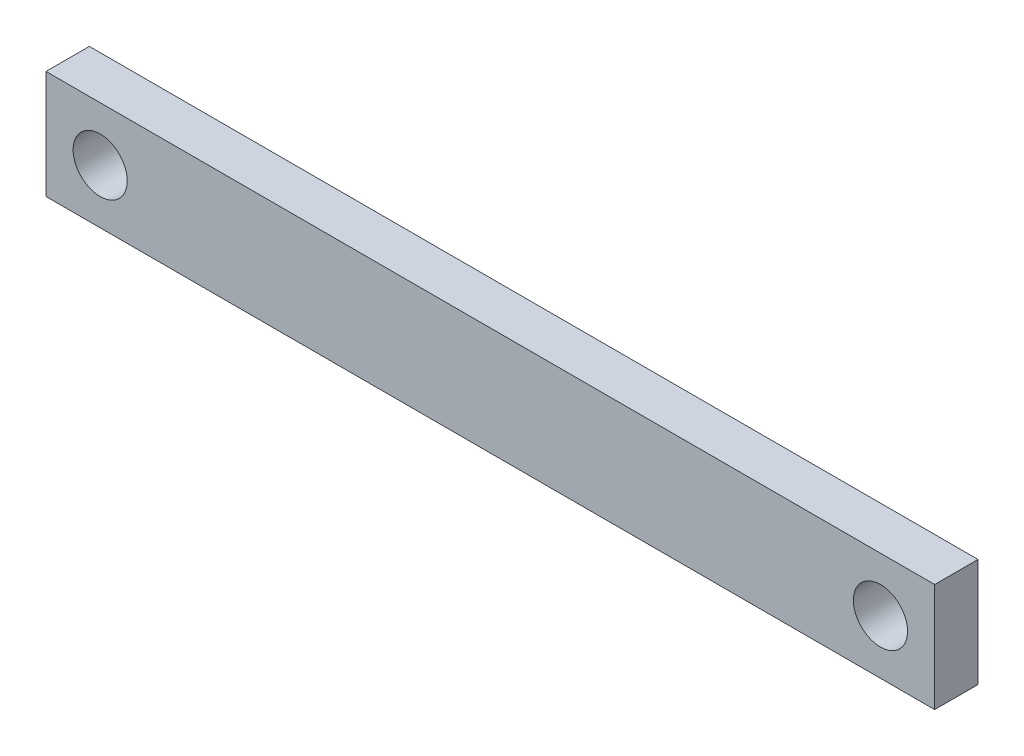
ISO-10303-21;
HEADER;
FILE_DESCRIPTION(('STEP AP214'),'2;1');
FILE_NAME('part.step','',(''),(''),'','','');
FILE_SCHEMA(('AUTOMOTIVE_DESIGN { 1 0 10303 214 1 1 1 1 }'));
ENDSEC;
DATA;
#1=APPLICATION_CONTEXT('core data for automotive mechanical design processes');
#2=APPLICATION_PROTOCOL_DEFINITION('international standard','automotive_design',2000,#1);
#3=PRODUCT_CONTEXT('',#1,'mechanical');
#4=PRODUCT('Part','Part','',(#3));
#5=PRODUCT_RELATED_PRODUCT_CATEGORY('part','',(#4));
#6=PRODUCT_DEFINITION_FORMATION('','',#4);
#7=PRODUCT_DEFINITION_CONTEXT('part definition',#1,'design');
#8=PRODUCT_DEFINITION('design','',#6,#7);
#9=PRODUCT_DEFINITION_SHAPE('','',#8);
#10=(LENGTH_UNIT() NAMED_UNIT(*) SI_UNIT(.MILLI.,.METRE.));
#11=(NAMED_UNIT(*) PLANE_ANGLE_UNIT() SI_UNIT($,.RADIAN.));
#12=(NAMED_UNIT(*) SI_UNIT($,.STERADIAN.) SOLID_ANGLE_UNIT());
#13=UNCERTAINTY_MEASURE_WITH_UNIT(LENGTH_MEASURE(1.E-05),#10,'distance_accuracy_value','');
#14=(GEOMETRIC_REPRESENTATION_CONTEXT(3) GLOBAL_UNCERTAINTY_ASSIGNED_CONTEXT((#13)) GLOBAL_UNIT_ASSIGNED_CONTEXT((#10,
#11,#12)) REPRESENTATION_CONTEXT('',''));
#15=CARTESIAN_POINT('',(0.,0.,0.));
#16=DIRECTION('',(0.,0.,1.));
#17=DIRECTION('',(1.,0.,0.));
#18=AXIS2_PLACEMENT_3D('',#15,#16,#17);
#19=CARTESIAN_POINT('',(0.,0.,2.));
#20=DIRECTION('',(0.,0.,1.));
#21=DIRECTION('',(1.,0.,0.));
#22=AXIS2_PLACEMENT_3D('',#19,#20,#21);
#23=PLANE('',#22);
#24=CARTESIAN_POINT('',(-14.7083649519347,9.32020141832394,2.));
#25=DIRECTION('',(0.,0.,1.));
#26=DIRECTION('',(1.,0.,0.));
#27=AXIS2_PLACEMENT_3D('',#24,#25,#26);
#28=CIRCLE('',#27,1.25);
#29=CARTESIAN_POINT('',(-13.4583649519347,9.32020141832394,2.));
#30=VERTEX_POINT('',#29);
#31=EDGE_CURVE('E100',#30,#30,#28,.T.);
#32=ORIENTED_EDGE('',*,*,#31,.F.);
#33=EDGE_LOOP('',(#32));
#34=FACE_BOUND('',#33,.T.);
#35=DIRECTION('',(0.,-1.,0.));
#36=VECTOR('',#35,1.);
#37=CARTESIAN_POINT('',(-17.2083649519347,11.8202014183239,2.));
#38=LINE('',#37,#36);
#39=CARTESIAN_POINT('',(-17.2083649519347,11.8202014183239,2.));
#40=VERTEX_POINT('',#39);
#41=CARTESIAN_POINT('',(-17.2083649519347,6.82020141832394,2.));
#42=VERTEX_POINT('',#41);
#43=EDGE_CURVE('E85',#40,#42,#38,.T.);
#44=ORIENTED_EDGE('',*,*,#43,.T.);
#45=DIRECTION('',(1.,0.,0.));
#46=VECTOR('',#45,1.);
#47=CARTESIAN_POINT('',(-17.2083649519347,6.82020141832394,2.));
#48=LINE('',#47,#46);
#49=CARTESIAN_POINT('',(23.7916350480653,6.82020141832394,2.));
#50=VERTEX_POINT('',#49);
#51=EDGE_CURVE('E80',#42,#50,#48,.T.);
#52=ORIENTED_EDGE('',*,*,#51,.T.);
#53=DIRECTION('',(0.,1.,0.));
#54=VECTOR('',#53,1.);
#55=CARTESIAN_POINT('',(23.7916350480653,11.8202014183239,2.));
#56=LINE('',#55,#54);
#57=CARTESIAN_POINT('',(23.7916350480653,11.8202014183239,2.));
#58=VERTEX_POINT('',#57);
#59=EDGE_CURVE('E83',#50,#58,#56,.T.);
#60=ORIENTED_EDGE('',*,*,#59,.T.);
#61=DIRECTION('',(-1.,0.,0.));
#62=VECTOR('',#61,1.);
#63=CARTESIAN_POINT('',(-17.2083649519347,11.8202014183239,2.));
#64=LINE('',#63,#62);
#65=EDGE_CURVE('E50',#58,#40,#64,.T.);
#66=ORIENTED_EDGE('',*,*,#65,.T.);
#67=EDGE_LOOP('',(#44,#52,#60,#66));
#68=FACE_BOUND('',#67,.T.);
#69=CARTESIAN_POINT('',(21.2916350480653,9.32020141832394,2.));
#70=DIRECTION('',(0.,0.,1.));
#71=DIRECTION('',(1.,0.,0.));
#72=AXIS2_PLACEMENT_3D('',#69,#70,#71);
#73=CIRCLE('',#72,1.25);
#74=CARTESIAN_POINT('',(22.5416350480653,9.32020141832394,2.));
#75=VERTEX_POINT('',#74);
#76=EDGE_CURVE('E115',#75,#75,#73,.T.);
#77=ORIENTED_EDGE('',*,*,#76,.F.);
#78=EDGE_LOOP('',(#77));
#79=FACE_BOUND('',#78,.T.);
#80=ADVANCED_FACE('F33',(#34,#68,#79),#23,.T.);
#81=CARTESIAN_POINT('',(0.,0.,0.));
#82=DIRECTION('',(0.,0.,1.));
#83=DIRECTION('',(1.,0.,0.));
#84=AXIS2_PLACEMENT_3D('',#81,#82,#83);
#85=PLANE('',#84);
#86=DIRECTION('',(0.,-1.,0.));
#87=VECTOR('',#86,1.);
#88=CARTESIAN_POINT('',(-17.2083649519347,11.8202014183239,0.));
#89=LINE('',#88,#87);
#90=CARTESIAN_POINT('',(-17.2083649519347,11.8202014183239,0.));
#91=VERTEX_POINT('',#90);
#92=CARTESIAN_POINT('',(-17.2083649519347,6.82020141832394,0.));
#93=VERTEX_POINT('',#92);
#94=EDGE_CURVE('E97',#91,#93,#89,.T.);
#95=ORIENTED_EDGE('',*,*,#94,.F.);
#96=DIRECTION('',(-1.,0.,0.));
#97=VECTOR('',#96,1.);
#98=CARTESIAN_POINT('',(-17.2083649519347,11.8202014183239,0.));
#99=LINE('',#98,#97);
#100=CARTESIAN_POINT('',(23.7916350480653,11.8202014183239,0.));
#101=VERTEX_POINT('',#100);
#102=EDGE_CURVE('E73',#101,#91,#99,.T.);
#103=ORIENTED_EDGE('',*,*,#102,.F.);
#104=DIRECTION('',(0.,1.,0.));
#105=VECTOR('',#104,1.);
#106=CARTESIAN_POINT('',(23.7916350480653,11.8202014183239,0.));
#107=LINE('',#106,#105);
#108=CARTESIAN_POINT('',(23.7916350480653,6.82020141832394,0.));
#109=VERTEX_POINT('',#108);
#110=EDGE_CURVE('E67',#109,#101,#107,.T.);
#111=ORIENTED_EDGE('',*,*,#110,.F.);
#112=DIRECTION('',(1.,0.,0.));
#113=VECTOR('',#112,1.);
#114=CARTESIAN_POINT('',(-17.2083649519347,6.82020141832394,0.));
#115=LINE('',#114,#113);
#116=EDGE_CURVE('E89',#93,#109,#115,.T.);
#117=ORIENTED_EDGE('',*,*,#116,.F.);
#118=EDGE_LOOP('',(#95,#103,#111,#117));
#119=FACE_BOUND('',#118,.T.);
#120=CARTESIAN_POINT('',(-14.7083649519347,9.32020141832394,0.));
#121=DIRECTION('',(0.,0.,1.));
#122=DIRECTION('',(1.,0.,0.));
#123=AXIS2_PLACEMENT_3D('',#120,#121,#122);
#124=CIRCLE('',#123,1.25);
#125=CARTESIAN_POINT('',(-13.4583649519347,9.32020141832394,0.));
#126=VERTEX_POINT('',#125);
#127=EDGE_CURVE('E112',#126,#126,#124,.T.);
#128=ORIENTED_EDGE('',*,*,#127,.T.);
#129=EDGE_LOOP('',(#128));
#130=FACE_BOUND('',#129,.T.);
#131=CARTESIAN_POINT('',(21.2916350480653,9.32020141832394,0.));
#132=DIRECTION('',(0.,0.,1.));
#133=DIRECTION('',(1.,0.,0.));
#134=AXIS2_PLACEMENT_3D('',#131,#132,#133);
#135=CIRCLE('',#134,1.25);
#136=CARTESIAN_POINT('',(22.5416350480653,9.32020141832394,0.));
#137=VERTEX_POINT('',#136);
#138=EDGE_CURVE('E118',#137,#137,#135,.T.);
#139=ORIENTED_EDGE('',*,*,#138,.T.);
#140=EDGE_LOOP('',(#139));
#141=FACE_BOUND('',#140,.T.);
#142=ADVANCED_FACE('F108',(#119,#130,#141),#85,.F.);
#143=CARTESIAN_POINT('',(-17.2083649519347,11.8202014183239,2.));
#144=DIRECTION('',(1.,0.,0.));
#145=DIRECTION('',(0.,0.,-1.));
#146=AXIS2_PLACEMENT_3D('',#143,#144,#145);
#147=PLANE('',#146);
#148=ORIENTED_EDGE('',*,*,#94,.T.);
#149=DIRECTION('',(0.,0.,-1.));
#150=VECTOR('',#149,1.);
#151=CARTESIAN_POINT('',(-17.2083649519347,6.82020141832394,2.));
#152=LINE('',#151,#150);
#153=EDGE_CURVE('E11',#42,#93,#152,.T.);
#154=ORIENTED_EDGE('',*,*,#153,.F.);
#155=ORIENTED_EDGE('',*,*,#43,.F.);
#156=DIRECTION('',(0.,0.,-1.));
#157=VECTOR('',#156,1.);
#158=CARTESIAN_POINT('',(-17.2083649519347,11.8202014183239,2.));
#159=LINE('',#158,#157);
#160=EDGE_CURVE('E93',#40,#91,#159,.T.);
#161=ORIENTED_EDGE('',*,*,#160,.T.);
#162=EDGE_LOOP('',(#148,#154,#155,#161));
#163=FACE_BOUND('',#162,.T.);
#164=ADVANCED_FACE('F35',(#163),#147,.F.);
#165=CARTESIAN_POINT('',(-17.2083649519347,6.82020141832394,2.));
#166=DIRECTION('',(0.,1.,0.));
#167=DIRECTION('',(0.,0.,1.));
#168=AXIS2_PLACEMENT_3D('',#165,#166,#167);
#169=PLANE('',#168);
#170=ORIENTED_EDGE('',*,*,#116,.T.);
#171=DIRECTION('',(0.,0.,-1.));
#172=VECTOR('',#171,1.);
#173=CARTESIAN_POINT('',(23.7916350480653,6.82020141832394,2.));
#174=LINE('',#173,#172);
#175=EDGE_CURVE('E42',#50,#109,#174,.T.);
#176=ORIENTED_EDGE('',*,*,#175,.F.);
#177=ORIENTED_EDGE('',*,*,#51,.F.);
#178=ORIENTED_EDGE('',*,*,#153,.T.);
#179=EDGE_LOOP('',(#170,#176,#177,#178));
#180=FACE_BOUND('',#179,.T.);
#181=ADVANCED_FACE('F88',(#180),#169,.F.);
#182=CARTESIAN_POINT('',(23.7916350480653,11.8202014183239,2.));
#183=DIRECTION('',(-1.,0.,0.));
#184=DIRECTION('',(0.,-1.,0.));
#185=AXIS2_PLACEMENT_3D('',#182,#183,#184);
#186=PLANE('',#185);
#187=ORIENTED_EDGE('',*,*,#110,.T.);
#188=DIRECTION('',(0.,0.,-1.));
#189=VECTOR('',#188,1.);
#190=CARTESIAN_POINT('',(23.7916350480653,11.8202014183239,2.));
#191=LINE('',#190,#189);
#192=EDGE_CURVE('E90',#58,#101,#191,.T.);
#193=ORIENTED_EDGE('',*,*,#192,.F.);
#194=ORIENTED_EDGE('',*,*,#59,.F.);
#195=ORIENTED_EDGE('',*,*,#175,.T.);
#196=EDGE_LOOP('',(#187,#193,#194,#195));
#197=FACE_BOUND('',#196,.T.);
#198=ADVANCED_FACE('F91',(#197),#186,.F.);
#199=CARTESIAN_POINT('',(-17.2083649519347,11.8202014183239,2.));
#200=DIRECTION('',(0.,-1.,0.));
#201=DIRECTION('',(0.,0.,-1.));
#202=AXIS2_PLACEMENT_3D('',#199,#200,#201);
#203=PLANE('',#202);
#204=ORIENTED_EDGE('',*,*,#102,.T.);
#205=ORIENTED_EDGE('',*,*,#160,.F.);
#206=ORIENTED_EDGE('',*,*,#65,.F.);
#207=ORIENTED_EDGE('',*,*,#192,.T.);
#208=EDGE_LOOP('',(#204,#205,#206,#207));
#209=FACE_BOUND('',#208,.T.);
#210=ADVANCED_FACE('F105',(#209),#203,.F.);
#211=CARTESIAN_POINT('',(-14.7083649519347,9.32020141832394,2.));
#212=DIRECTION('',(0.,0.,-1.));
#213=DIRECTION('',(-1.,0.,0.));
#214=AXIS2_PLACEMENT_3D('',#211,#212,#213);
#215=CYLINDRICAL_SURFACE('',#214,1.25);
#216=ORIENTED_EDGE('',*,*,#31,.T.);
#217=EDGE_LOOP('',(#216));
#218=FACE_BOUND('',#217,.T.);
#219=ORIENTED_EDGE('',*,*,#127,.F.);
#220=EDGE_LOOP('',(#219));
#221=FACE_BOUND('',#220,.T.);
#222=ADVANCED_FACE('F135',(#218,#221),#215,.F.);
#223=CARTESIAN_POINT('',(21.2916350480653,9.32020141832394,2.));
#224=DIRECTION('',(0.,0.,-1.));
#225=DIRECTION('',(-1.,0.,0.));
#226=AXIS2_PLACEMENT_3D('',#223,#224,#225);
#227=CYLINDRICAL_SURFACE('',#226,1.25);
#228=ORIENTED_EDGE('',*,*,#76,.T.);
#229=EDGE_LOOP('',(#228));
#230=FACE_BOUND('',#229,.T.);
#231=ORIENTED_EDGE('',*,*,#138,.F.);
#232=EDGE_LOOP('',(#231));
#233=FACE_BOUND('',#232,.T.);
#234=ADVANCED_FACE('F124',(#230,#233),#227,.F.);
#235=CLOSED_SHELL('',(#80,#142,#164,#181,#198,#210,#222,#234));
#236=MANIFOLD_SOLID_BREP('B2',#235);
#237=ADVANCED_BREP_SHAPE_REPRESENTATION('',(#18,#236),#14);
#238=SHAPE_DEFINITION_REPRESENTATION(#9,#237);
ENDSEC;
END-ISO-10303-21;
